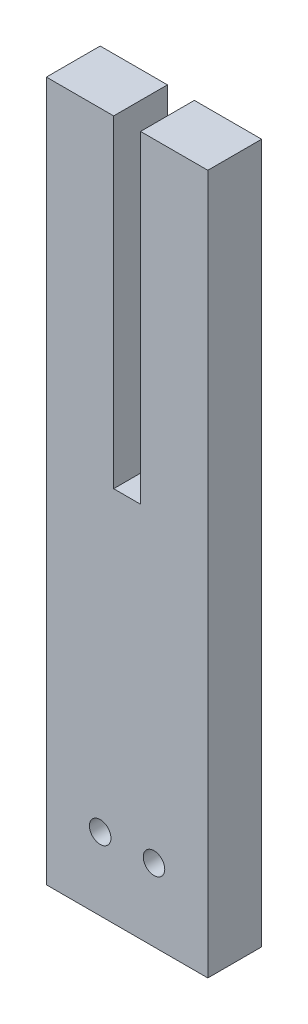
ISO-10303-21;
HEADER;
FILE_DESCRIPTION(('STEP AP214'),'2;1');
FILE_NAME('part.step','',(''),(''),'','','');
FILE_SCHEMA(('AUTOMOTIVE_DESIGN { 1 0 10303 214 1 1 1 1 }'));
ENDSEC;
DATA;
#1=APPLICATION_CONTEXT('core data for automotive mechanical design processes');
#2=APPLICATION_PROTOCOL_DEFINITION('international standard','automotive_design',2000,#1);
#3=PRODUCT_CONTEXT('',#1,'mechanical');
#4=PRODUCT('Part','Part','',(#3));
#5=PRODUCT_RELATED_PRODUCT_CATEGORY('part','',(#4));
#6=PRODUCT_DEFINITION_FORMATION('','',#4);
#7=PRODUCT_DEFINITION_CONTEXT('part definition',#1,'design');
#8=PRODUCT_DEFINITION('design','',#6,#7);
#9=PRODUCT_DEFINITION_SHAPE('','',#8);
#10=(LENGTH_UNIT() NAMED_UNIT(*) SI_UNIT(.MILLI.,.METRE.));
#11=(NAMED_UNIT(*) PLANE_ANGLE_UNIT() SI_UNIT($,.RADIAN.));
#12=(NAMED_UNIT(*) SI_UNIT($,.STERADIAN.) SOLID_ANGLE_UNIT());
#13=UNCERTAINTY_MEASURE_WITH_UNIT(LENGTH_MEASURE(1.E-05),#10,'distance_accuracy_value','');
#14=(GEOMETRIC_REPRESENTATION_CONTEXT(3) GLOBAL_UNCERTAINTY_ASSIGNED_CONTEXT((#13)) GLOBAL_UNIT_ASSIGNED_CONTEXT((#10,
#11,#12)) REPRESENTATION_CONTEXT('',''));
#15=CARTESIAN_POINT('',(0.,0.,0.));
#16=DIRECTION('',(0.,0.,1.));
#17=DIRECTION('',(1.,0.,0.));
#18=AXIS2_PLACEMENT_3D('',#15,#16,#17);
#19=CARTESIAN_POINT('',(-15.001,60.,10.));
#20=DIRECTION('',(0.,-1.,0.));
#21=DIRECTION('',(0.,0.,-1.));
#22=AXIS2_PLACEMENT_3D('',#19,#20,#21);
#23=PLANE('',#22);
#24=DIRECTION('',(1.,0.,0.));
#25=VECTOR('',#24,1.);
#26=CARTESIAN_POINT('',(-15.001,60.,10.));
#27=LINE('',#26,#25);
#28=CARTESIAN_POINT('',(-15.,60.,10.));
#29=VERTEX_POINT('',#28);
#30=CARTESIAN_POINT('',(-2.50000000000001,60.,10.));
#31=VERTEX_POINT('',#30);
#32=EDGE_CURVE('E138',#29,#31,#27,.T.);
#33=ORIENTED_EDGE('',*,*,#32,.T.);
#34=DIRECTION('',(0.,0.,1.));
#35=VECTOR('',#34,1.);
#36=CARTESIAN_POINT('',(-2.50000000000001,60.,-0.000999999999999265));
#37=LINE('',#36,#35);
#38=CARTESIAN_POINT('',(-2.50000000000001,60.,0.));
#39=VERTEX_POINT('',#38);
#40=EDGE_CURVE('E115',#39,#31,#37,.T.);
#41=ORIENTED_EDGE('',*,*,#40,.F.);
#42=DIRECTION('',(1.,0.,0.));
#43=VECTOR('',#42,1.);
#44=CARTESIAN_POINT('',(-15.001,60.,0.));
#45=LINE('',#44,#43);
#46=CARTESIAN_POINT('',(-15.,60.,0.));
#47=VERTEX_POINT('',#46);
#48=EDGE_CURVE('E121',#47,#39,#45,.T.);
#49=ORIENTED_EDGE('',*,*,#48,.F.);
#50=DIRECTION('',(0.,0.,1.));
#51=VECTOR('',#50,1.);
#52=CARTESIAN_POINT('',(-15.,60.,10.));
#53=LINE('',#52,#51);
#54=EDGE_CURVE('E137',#47,#29,#53,.T.);
#55=ORIENTED_EDGE('',*,*,#54,.T.);
#56=EDGE_LOOP('',(#33,#41,#49,#55));
#57=FACE_BOUND('',#56,.T.);
#58=ADVANCED_FACE('F31',(#57),#23,.F.);
#59=CARTESIAN_POINT('',(-15.,70.,10.));
#60=DIRECTION('',(1.,0.,0.));
#61=DIRECTION('',(0.,1.,0.));
#62=AXIS2_PLACEMENT_3D('',#59,#60,#61);
#63=PLANE('',#62);
#64=DIRECTION('',(0.,-1.,0.));
#65=VECTOR('',#64,1.);
#66=CARTESIAN_POINT('',(-15.,70.,10.));
#67=LINE('',#66,#65);
#68=CARTESIAN_POINT('',(-15.,-70.,10.));
#69=VERTEX_POINT('',#68);
#70=EDGE_CURVE('E155',#29,#69,#67,.T.);
#71=ORIENTED_EDGE('',*,*,#70,.F.);
#72=ORIENTED_EDGE('',*,*,#54,.F.);
#73=DIRECTION('',(0.,-1.,0.));
#74=VECTOR('',#73,1.);
#75=CARTESIAN_POINT('',(-15.,70.,0.));
#76=LINE('',#75,#74);
#77=CARTESIAN_POINT('',(-15.,-70.,0.));
#78=VERTEX_POINT('',#77);
#79=EDGE_CURVE('E154',#47,#78,#76,.T.);
#80=ORIENTED_EDGE('',*,*,#79,.T.);
#81=DIRECTION('',(0.,0.,-1.));
#82=VECTOR('',#81,1.);
#83=CARTESIAN_POINT('',(-15.,-70.,10.));
#84=LINE('',#83,#82);
#85=EDGE_CURVE('E11',#69,#78,#84,.T.);
#86=ORIENTED_EDGE('',*,*,#85,.F.);
#87=EDGE_LOOP('',(#71,#72,#80,#86));
#88=FACE_BOUND('',#87,.T.);
#89=ADVANCED_FACE('F33',(#88),#63,.F.);
#90=CARTESIAN_POINT('',(-15.,-70.,10.));
#91=DIRECTION('',(0.,1.,0.));
#92=DIRECTION('',(0.,0.,1.));
#93=AXIS2_PLACEMENT_3D('',#90,#91,#92);
#94=PLANE('',#93);
#95=DIRECTION('',(1.,0.,0.));
#96=VECTOR('',#95,1.);
#97=CARTESIAN_POINT('',(-15.,-70.,0.));
#98=LINE('',#97,#96);
#99=CARTESIAN_POINT('',(15.,-70.,0.));
#100=VERTEX_POINT('',#99);
#101=EDGE_CURVE('E164',#78,#100,#98,.T.);
#102=ORIENTED_EDGE('',*,*,#101,.T.);
#103=DIRECTION('',(0.,0.,-1.));
#104=VECTOR('',#103,1.);
#105=CARTESIAN_POINT('',(15.,-70.,10.));
#106=LINE('',#105,#104);
#107=CARTESIAN_POINT('',(15.,-70.,10.));
#108=VERTEX_POINT('',#107);
#109=EDGE_CURVE('E39',#108,#100,#106,.T.);
#110=ORIENTED_EDGE('',*,*,#109,.F.);
#111=DIRECTION('',(1.,0.,0.));
#112=VECTOR('',#111,1.);
#113=CARTESIAN_POINT('',(-15.,-70.,10.));
#114=LINE('',#113,#112);
#115=EDGE_CURVE('E157',#69,#108,#114,.T.);
#116=ORIENTED_EDGE('',*,*,#115,.F.);
#117=ORIENTED_EDGE('',*,*,#85,.T.);
#118=EDGE_LOOP('',(#102,#110,#116,#117));
#119=FACE_BOUND('',#118,.T.);
#120=ADVANCED_FACE('F177',(#119),#94,.F.);
#121=CARTESIAN_POINT('',(15.,70.,10.));
#122=DIRECTION('',(-1.,0.,0.));
#123=DIRECTION('',(0.,-1.,0.));
#124=AXIS2_PLACEMENT_3D('',#121,#122,#123);
#125=PLANE('',#124);
#126=DIRECTION('',(0.,1.,0.));
#127=VECTOR('',#126,1.);
#128=CARTESIAN_POINT('',(15.,70.,0.));
#129=LINE('',#128,#127);
#130=CARTESIAN_POINT('',(15.,60.,0.));
#131=VERTEX_POINT('',#130);
#132=EDGE_CURVE('E158',#100,#131,#129,.T.);
#133=ORIENTED_EDGE('',*,*,#132,.T.);
#134=DIRECTION('',(0.,0.,-1.));
#135=VECTOR('',#134,1.);
#136=CARTESIAN_POINT('',(15.,60.,10.));
#137=LINE('',#136,#135);
#138=CARTESIAN_POINT('',(15.,60.,10.));
#139=VERTEX_POINT('',#138);
#140=EDGE_CURVE('E114',#139,#131,#137,.T.);
#141=ORIENTED_EDGE('',*,*,#140,.F.);
#142=DIRECTION('',(0.,1.,0.));
#143=VECTOR('',#142,1.);
#144=CARTESIAN_POINT('',(15.,70.,10.));
#145=LINE('',#144,#143);
#146=EDGE_CURVE('E160',#108,#139,#145,.T.);
#147=ORIENTED_EDGE('',*,*,#146,.F.);
#148=ORIENTED_EDGE('',*,*,#109,.T.);
#149=EDGE_LOOP('',(#133,#141,#147,#148));
#150=FACE_BOUND('',#149,.T.);
#151=ADVANCED_FACE('F171',(#150),#125,.F.);
#152=CARTESIAN_POINT('',(-15.,-70.,10.));
#153=DIRECTION('',(0.,0.,1.));
#154=DIRECTION('',(1.,0.,0.));
#155=AXIS2_PLACEMENT_3D('',#152,#153,#154);
#156=PLANE('',#155);
#157=DIRECTION('',(0.,-1.,0.));
#158=VECTOR('',#157,1.);
#159=CARTESIAN_POINT('',(-2.50000000000001,60.,10.));
#160=LINE('',#159,#158);
#161=CARTESIAN_POINT('',(-2.5,0.,10.));
#162=VERTEX_POINT('',#161);
#163=EDGE_CURVE('E104',#31,#162,#160,.T.);
#164=ORIENTED_EDGE('',*,*,#163,.F.);
#165=ORIENTED_EDGE('',*,*,#32,.F.);
#166=ORIENTED_EDGE('',*,*,#70,.T.);
#167=ORIENTED_EDGE('',*,*,#115,.T.);
#168=ORIENTED_EDGE('',*,*,#146,.T.);
#169=CARTESIAN_POINT('',(2.49999999999999,60.,10.));
#170=VERTEX_POINT('',#169);
#171=EDGE_CURVE('E135',#170,#139,#27,.T.);
#172=ORIENTED_EDGE('',*,*,#171,.F.);
#173=DIRECTION('',(0.,1.,0.));
#174=VECTOR('',#173,1.);
#175=CARTESIAN_POINT('',(2.49999999999999,60.,10.));
#176=LINE('',#175,#174);
#177=CARTESIAN_POINT('',(2.5,0.,10.));
#178=VERTEX_POINT('',#177);
#179=EDGE_CURVE('E46',#178,#170,#176,.T.);
#180=ORIENTED_EDGE('',*,*,#179,.F.);
#181=DIRECTION('',(1.,0.,0.));
#182=VECTOR('',#181,1.);
#183=CARTESIAN_POINT('',(-2.5,0.,10.));
#184=LINE('',#183,#182);
#185=EDGE_CURVE('E124',#162,#178,#184,.T.);
#186=ORIENTED_EDGE('',*,*,#185,.F.);
#187=EDGE_LOOP('',(#164,#165,#166,#167,#168,#172,#180,#186));
#188=FACE_BOUND('',#187,.T.);
#189=CARTESIAN_POINT('',(5.00000000000001,-56.5,10.));
#190=DIRECTION('',(0.,0.,1.));
#191=DIRECTION('',(1.,0.,0.));
#192=AXIS2_PLACEMENT_3D('',#189,#190,#191);
#193=CIRCLE('',#192,2.);
#194=CARTESIAN_POINT('',(7.00000000000001,-56.5,10.));
#195=VERTEX_POINT('',#194);
#196=EDGE_CURVE('E142',#195,#195,#193,.T.);
#197=ORIENTED_EDGE('',*,*,#196,.F.);
#198=EDGE_LOOP('',(#197));
#199=FACE_BOUND('',#198,.T.);
#200=CARTESIAN_POINT('',(-5.,-56.5,10.));
#201=DIRECTION('',(0.,0.,1.));
#202=DIRECTION('',(1.,0.,0.));
#203=AXIS2_PLACEMENT_3D('',#200,#201,#202);
#204=CIRCLE('',#203,2.);
#205=CARTESIAN_POINT('',(-3.,-56.5,10.));
#206=VERTEX_POINT('',#205);
#207=EDGE_CURVE('E148',#206,#206,#204,.T.);
#208=ORIENTED_EDGE('',*,*,#207,.F.);
#209=EDGE_LOOP('',(#208));
#210=FACE_BOUND('',#209,.T.);
#211=ADVANCED_FACE('F184',(#188,#199,#210),#156,.T.);
#212=CARTESIAN_POINT('',(-15.,-70.,0.));
#213=DIRECTION('',(0.,0.,1.));
#214=DIRECTION('',(1.,0.,0.));
#215=AXIS2_PLACEMENT_3D('',#212,#213,#214);
#216=PLANE('',#215);
#217=ORIENTED_EDGE('',*,*,#48,.T.);
#218=DIRECTION('',(0.,1.,0.));
#219=VECTOR('',#218,1.);
#220=CARTESIAN_POINT('',(-2.50000000000001,60.,0.));
#221=LINE('',#220,#219);
#222=CARTESIAN_POINT('',(-2.5,0.,0.));
#223=VERTEX_POINT('',#222);
#224=EDGE_CURVE('E101',#223,#39,#221,.T.);
#225=ORIENTED_EDGE('',*,*,#224,.F.);
#226=DIRECTION('',(-1.,0.,0.));
#227=VECTOR('',#226,1.);
#228=CARTESIAN_POINT('',(-2.5,0.,0.));
#229=LINE('',#228,#227);
#230=CARTESIAN_POINT('',(2.5,0.,0.));
#231=VERTEX_POINT('',#230);
#232=EDGE_CURVE('E111',#231,#223,#229,.T.);
#233=ORIENTED_EDGE('',*,*,#232,.F.);
#234=DIRECTION('',(0.,-1.,0.));
#235=VECTOR('',#234,1.);
#236=CARTESIAN_POINT('',(2.49999999999999,60.,0.));
#237=LINE('',#236,#235);
#238=CARTESIAN_POINT('',(2.49999999999999,60.,0.));
#239=VERTEX_POINT('',#238);
#240=EDGE_CURVE('E122',#239,#231,#237,.T.);
#241=ORIENTED_EDGE('',*,*,#240,.F.);
#242=EDGE_CURVE('E54',#239,#131,#45,.T.);
#243=ORIENTED_EDGE('',*,*,#242,.T.);
#244=ORIENTED_EDGE('',*,*,#132,.F.);
#245=ORIENTED_EDGE('',*,*,#101,.F.);
#246=ORIENTED_EDGE('',*,*,#79,.F.);
#247=EDGE_LOOP('',(#217,#225,#233,#241,#243,#244,#245,#246));
#248=FACE_BOUND('',#247,.T.);
#249=CARTESIAN_POINT('',(5.00000000000001,-56.5,0.));
#250=DIRECTION('',(0.,0.,1.));
#251=DIRECTION('',(1.,0.,0.));
#252=AXIS2_PLACEMENT_3D('',#249,#250,#251);
#253=CIRCLE('',#252,2.);
#254=CARTESIAN_POINT('',(7.00000000000001,-56.5,0.));
#255=VERTEX_POINT('',#254);
#256=EDGE_CURVE('E145',#255,#255,#253,.F.);
#257=ORIENTED_EDGE('',*,*,#256,.F.);
#258=EDGE_LOOP('',(#257));
#259=FACE_BOUND('',#258,.T.);
#260=CARTESIAN_POINT('',(-5.,-56.5,0.));
#261=DIRECTION('',(0.,0.,1.));
#262=DIRECTION('',(1.,0.,0.));
#263=AXIS2_PLACEMENT_3D('',#260,#261,#262);
#264=CIRCLE('',#263,2.);
#265=CARTESIAN_POINT('',(-3.,-56.5,0.));
#266=VERTEX_POINT('',#265);
#267=EDGE_CURVE('E151',#266,#266,#264,.F.);
#268=ORIENTED_EDGE('',*,*,#267,.F.);
#269=EDGE_LOOP('',(#268));
#270=FACE_BOUND('',#269,.T.);
#271=ADVANCED_FACE('F118',(#248,#259,#270),#216,.F.);
#272=CARTESIAN_POINT('',(-5.,-56.5,-0.000999999999999265));
#273=DIRECTION('',(0.,0.,1.));
#274=DIRECTION('',(1.,0.,0.));
#275=AXIS2_PLACEMENT_3D('',#272,#273,#274);
#276=CYLINDRICAL_SURFACE('',#275,2.);
#277=ORIENTED_EDGE('',*,*,#207,.T.);
#278=EDGE_LOOP('',(#277));
#279=FACE_BOUND('',#278,.T.);
#280=ORIENTED_EDGE('',*,*,#267,.T.);
#281=EDGE_LOOP('',(#280));
#282=FACE_BOUND('',#281,.T.);
#283=ADVANCED_FACE('F209',(#279,#282),#276,.F.);
#284=CARTESIAN_POINT('',(5.00000000000001,-56.5,-0.000999999999999265));
#285=DIRECTION('',(0.,0.,1.));
#286=DIRECTION('',(1.,0.,0.));
#287=AXIS2_PLACEMENT_3D('',#284,#285,#286);
#288=CYLINDRICAL_SURFACE('',#287,2.);
#289=ORIENTED_EDGE('',*,*,#196,.T.);
#290=EDGE_LOOP('',(#289));
#291=FACE_BOUND('',#290,.T.);
#292=ORIENTED_EDGE('',*,*,#256,.T.);
#293=EDGE_LOOP('',(#292));
#294=FACE_BOUND('',#293,.T.);
#295=ADVANCED_FACE('F205',(#291,#294),#288,.F.);
#296=ORIENTED_EDGE('',*,*,#242,.F.);
#297=DIRECTION('',(0.,0.,1.));
#298=VECTOR('',#297,1.);
#299=CARTESIAN_POINT('',(2.49999999999999,60.,-0.000999999999999265));
#300=LINE('',#299,#298);
#301=EDGE_CURVE('E131',#239,#170,#300,.T.);
#302=ORIENTED_EDGE('',*,*,#301,.T.);
#303=ORIENTED_EDGE('',*,*,#171,.T.);
#304=ORIENTED_EDGE('',*,*,#140,.T.);
#305=EDGE_LOOP('',(#296,#302,#303,#304));
#306=FACE_BOUND('',#305,.T.);
#307=ADVANCED_FACE('F188',(#306),#23,.F.);
#308=CARTESIAN_POINT('',(-2.50000000000001,60.,-0.000999999999999265));
#309=DIRECTION('',(-1.,0.,0.));
#310=DIRECTION('',(0.,-1.,0.));
#311=AXIS2_PLACEMENT_3D('',#308,#309,#310);
#312=PLANE('',#311);
#313=ORIENTED_EDGE('',*,*,#224,.T.);
#314=ORIENTED_EDGE('',*,*,#40,.T.);
#315=ORIENTED_EDGE('',*,*,#163,.T.);
#316=DIRECTION('',(0.,0.,1.));
#317=VECTOR('',#316,1.);
#318=CARTESIAN_POINT('',(-2.5,0.,-0.000999999999999265));
#319=LINE('',#318,#317);
#320=EDGE_CURVE('E97',#223,#162,#319,.T.);
#321=ORIENTED_EDGE('',*,*,#320,.F.);
#322=EDGE_LOOP('',(#313,#314,#315,#321));
#323=FACE_BOUND('',#322,.T.);
#324=ADVANCED_FACE('F99',(#323),#312,.F.);
#325=CARTESIAN_POINT('',(2.49999999999999,60.,-0.000999999999999265));
#326=DIRECTION('',(1.,0.,0.));
#327=DIRECTION('',(0.,1.,0.));
#328=AXIS2_PLACEMENT_3D('',#325,#326,#327);
#329=PLANE('',#328);
#330=ORIENTED_EDGE('',*,*,#240,.T.);
#331=DIRECTION('',(0.,0.,1.));
#332=VECTOR('',#331,1.);
#333=CARTESIAN_POINT('',(2.5,0.,-0.000999999999999265));
#334=LINE('',#333,#332);
#335=EDGE_CURVE('E108',#231,#178,#334,.T.);
#336=ORIENTED_EDGE('',*,*,#335,.T.);
#337=ORIENTED_EDGE('',*,*,#179,.T.);
#338=ORIENTED_EDGE('',*,*,#301,.F.);
#339=EDGE_LOOP('',(#330,#336,#337,#338));
#340=FACE_BOUND('',#339,.T.);
#341=ADVANCED_FACE('F189',(#340),#329,.F.);
#342=CARTESIAN_POINT('',(-2.5,0.,-0.000999999999999265));
#343=DIRECTION('',(0.,-1.,0.));
#344=DIRECTION('',(0.,0.,-1.));
#345=AXIS2_PLACEMENT_3D('',#342,#343,#344);
#346=PLANE('',#345);
#347=ORIENTED_EDGE('',*,*,#232,.T.);
#348=ORIENTED_EDGE('',*,*,#320,.T.);
#349=ORIENTED_EDGE('',*,*,#185,.T.);
#350=ORIENTED_EDGE('',*,*,#335,.F.);
#351=EDGE_LOOP('',(#347,#348,#349,#350));
#352=FACE_BOUND('',#351,.T.);
#353=ADVANCED_FACE('F112',(#352),#346,.F.);
#354=CLOSED_SHELL('',(#58,#89,#120,#151,#211,#271,#283,#295,#307,#324,#341,#353));
#355=MANIFOLD_SOLID_BREP('B2',#354);
#356=ADVANCED_BREP_SHAPE_REPRESENTATION('',(#18,#355),#14);
#357=SHAPE_DEFINITION_REPRESENTATION(#9,#356);
ENDSEC;
END-ISO-10303-21;
